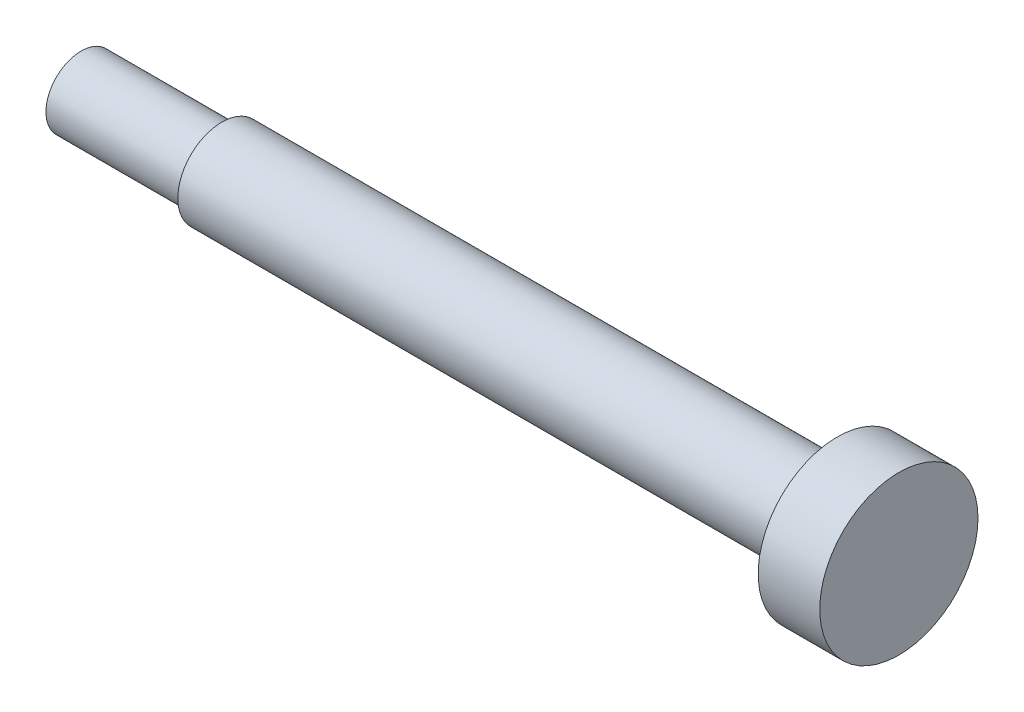
ISO-10303-21;
HEADER;
FILE_DESCRIPTION(('STEP AP214'),'2;1');
FILE_NAME('part.step','',(''),(''),'','','');
FILE_SCHEMA(('AUTOMOTIVE_DESIGN { 1 0 10303 214 1 1 1 1 }'));
ENDSEC;
DATA;
#1=APPLICATION_CONTEXT('core data for automotive mechanical design processes');
#2=APPLICATION_PROTOCOL_DEFINITION('international standard','automotive_design',2000,#1);
#3=PRODUCT_CONTEXT('',#1,'mechanical');
#4=PRODUCT('Part','Part','',(#3));
#5=PRODUCT_RELATED_PRODUCT_CATEGORY('part','',(#4));
#6=PRODUCT_DEFINITION_FORMATION('','',#4);
#7=PRODUCT_DEFINITION_CONTEXT('part definition',#1,'design');
#8=PRODUCT_DEFINITION('design','',#6,#7);
#9=PRODUCT_DEFINITION_SHAPE('','',#8);
#10=(LENGTH_UNIT() NAMED_UNIT(*) SI_UNIT(.MILLI.,.METRE.));
#11=(NAMED_UNIT(*) PLANE_ANGLE_UNIT() SI_UNIT($,.RADIAN.));
#12=(NAMED_UNIT(*) SI_UNIT($,.STERADIAN.) SOLID_ANGLE_UNIT());
#13=UNCERTAINTY_MEASURE_WITH_UNIT(LENGTH_MEASURE(1.E-05),#10,'distance_accuracy_value','');
#14=(GEOMETRIC_REPRESENTATION_CONTEXT(3) GLOBAL_UNCERTAINTY_ASSIGNED_CONTEXT((#13)) GLOBAL_UNIT_ASSIGNED_CONTEXT((#10,
#11,#12)) REPRESENTATION_CONTEXT('',''));
#15=CARTESIAN_POINT('',(0.,0.,0.));
#16=DIRECTION('',(0.,0.,1.));
#17=DIRECTION('',(1.,0.,0.));
#18=AXIS2_PLACEMENT_3D('',#15,#16,#17);
#19=CARTESIAN_POINT('',(3.5,0.,0.));
#20=DIRECTION('',(1.,0.,0.));
#21=DIRECTION('',(0.,0.,-1.));
#22=AXIS2_PLACEMENT_3D('',#19,#20,#21);
#23=PLANE('',#22);
#24=CARTESIAN_POINT('',(3.5,0.,0.));
#25=DIRECTION('',(1.,0.,0.));
#26=DIRECTION('',(0.,0.,-1.));
#27=AXIS2_PLACEMENT_3D('',#24,#25,#26);
#28=CIRCLE('',#27,4.49999999999999);
#29=CARTESIAN_POINT('',(3.5,0.,-4.49999999999999));
#30=VERTEX_POINT('',#29);
#31=EDGE_CURVE('E10',#30,#30,#28,.T.);
#32=ORIENTED_EDGE('',*,*,#31,.T.);
#33=EDGE_LOOP('',(#32));
#34=FACE_BOUND('',#33,.T.);
#35=ADVANCED_FACE('F35',(#34),#23,.T.);
#36=CARTESIAN_POINT('',(0.,0.,0.));
#37=DIRECTION('',(1.,0.,0.));
#38=DIRECTION('',(0.,0.,-1.));
#39=AXIS2_PLACEMENT_3D('',#36,#37,#38);
#40=CYLINDRICAL_SURFACE('',#39,4.49999999999999);
#41=CARTESIAN_POINT('',(0.,0.,0.));
#42=DIRECTION('',(1.,0.,0.));
#43=DIRECTION('',(0.,0.,-1.));
#44=AXIS2_PLACEMENT_3D('',#41,#42,#43);
#45=CIRCLE('',#44,4.49999999999999);
#46=CARTESIAN_POINT('',(0.,0.,-4.49999999999999));
#47=VERTEX_POINT('',#46);
#48=EDGE_CURVE('E41',#47,#47,#45,.T.);
#49=ORIENTED_EDGE('',*,*,#48,.T.);
#50=EDGE_LOOP('',(#49));
#51=FACE_BOUND('',#50,.T.);
#52=ORIENTED_EDGE('',*,*,#31,.F.);
#53=EDGE_LOOP('',(#52));
#54=FACE_BOUND('',#53,.T.);
#55=ADVANCED_FACE('F73',(#51,#54),#40,.T.);
#56=CARTESIAN_POINT('',(0.,4.49999999999999,0.));
#57=DIRECTION('',(-1.,0.,0.));
#58=DIRECTION('',(0.,0.,1.));
#59=AXIS2_PLACEMENT_3D('',#56,#57,#58);
#60=PLANE('',#59);
#61=CARTESIAN_POINT('',(0.,0.,0.));
#62=DIRECTION('',(1.,0.,0.));
#63=DIRECTION('',(0.,0.,-1.));
#64=AXIS2_PLACEMENT_3D('',#61,#62,#63);
#65=CIRCLE('',#64,2.49999999999999);
#66=CARTESIAN_POINT('',(0.,0.,-2.49999999999999));
#67=VERTEX_POINT('',#66);
#68=EDGE_CURVE('E45',#67,#67,#65,.T.);
#69=ORIENTED_EDGE('',*,*,#68,.T.);
#70=EDGE_LOOP('',(#69));
#71=FACE_BOUND('',#70,.T.);
#72=ORIENTED_EDGE('',*,*,#48,.F.);
#73=EDGE_LOOP('',(#72));
#74=FACE_BOUND('',#73,.T.);
#75=ADVANCED_FACE('F77',(#71,#74),#60,.T.);
#76=CARTESIAN_POINT('',(0.,0.,0.));
#77=DIRECTION('',(1.,0.,0.));
#78=DIRECTION('',(0.,0.,-1.));
#79=AXIS2_PLACEMENT_3D('',#76,#77,#78);
#80=CYLINDRICAL_SURFACE('',#79,2.49999999999999);
#81=CARTESIAN_POINT('',(-35.,0.,0.));
#82=DIRECTION('',(1.,0.,0.));
#83=DIRECTION('',(0.,0.,-1.));
#84=AXIS2_PLACEMENT_3D('',#81,#82,#83);
#85=CIRCLE('',#84,2.49999999999999);
#86=CARTESIAN_POINT('',(-35.,0.,-2.49999999999999));
#87=VERTEX_POINT('',#86);
#88=EDGE_CURVE('E49',#87,#87,#85,.T.);
#89=ORIENTED_EDGE('',*,*,#88,.T.);
#90=EDGE_LOOP('',(#89));
#91=FACE_BOUND('',#90,.T.);
#92=ORIENTED_EDGE('',*,*,#68,.F.);
#93=EDGE_LOOP('',(#92));
#94=FACE_BOUND('',#93,.T.);
#95=ADVANCED_FACE('F81',(#91,#94),#80,.T.);
#96=CARTESIAN_POINT('',(-35.,2.49999999999999,0.));
#97=DIRECTION('',(-1.,0.,0.));
#98=DIRECTION('',(0.,0.,1.));
#99=AXIS2_PLACEMENT_3D('',#96,#97,#98);
#100=PLANE('',#99);
#101=CARTESIAN_POINT('',(-35.,0.,0.));
#102=DIRECTION('',(1.,0.,0.));
#103=DIRECTION('',(0.,0.,-1.));
#104=AXIS2_PLACEMENT_3D('',#101,#102,#103);
#105=CIRCLE('',#104,1.99999999999999);
#106=CARTESIAN_POINT('',(-35.,0.,-1.99999999999999));
#107=VERTEX_POINT('',#106);
#108=EDGE_CURVE('E54',#107,#107,#105,.T.);
#109=ORIENTED_EDGE('',*,*,#108,.T.);
#110=EDGE_LOOP('',(#109));
#111=FACE_BOUND('',#110,.T.);
#112=ORIENTED_EDGE('',*,*,#88,.F.);
#113=EDGE_LOOP('',(#112));
#114=FACE_BOUND('',#113,.T.);
#115=ADVANCED_FACE('F70',(#111,#114),#100,.T.);
#116=CARTESIAN_POINT('',(0.,0.,0.));
#117=DIRECTION('',(1.,0.,0.));
#118=DIRECTION('',(0.,0.,-1.));
#119=AXIS2_PLACEMENT_3D('',#116,#117,#118);
#120=CYLINDRICAL_SURFACE('',#119,1.99999999999999);
#121=CARTESIAN_POINT('',(-43.,0.,0.));
#122=DIRECTION('',(1.,0.,0.));
#123=DIRECTION('',(0.,0.,-1.));
#124=AXIS2_PLACEMENT_3D('',#121,#122,#123);
#125=CIRCLE('',#124,1.99999999999999);
#126=CARTESIAN_POINT('',(-43.,0.,-1.99999999999999));
#127=VERTEX_POINT('',#126);
#128=EDGE_CURVE('E57',#127,#127,#125,.T.);
#129=ORIENTED_EDGE('',*,*,#128,.T.);
#130=EDGE_LOOP('',(#129));
#131=FACE_BOUND('',#130,.T.);
#132=ORIENTED_EDGE('',*,*,#108,.F.);
#133=EDGE_LOOP('',(#132));
#134=FACE_BOUND('',#133,.T.);
#135=ADVANCED_FACE('F61',(#131,#134),#120,.T.);
#136=CARTESIAN_POINT('',(-43.,1.99999999999999,0.));
#137=DIRECTION('',(-1.,0.,0.));
#138=DIRECTION('',(0.,0.,1.));
#139=AXIS2_PLACEMENT_3D('',#136,#137,#138);
#140=PLANE('',#139);
#141=ORIENTED_EDGE('',*,*,#128,.F.);
#142=EDGE_LOOP('',(#141));
#143=FACE_BOUND('',#142,.T.);
#144=ADVANCED_FACE('F64',(#143),#140,.T.);
#145=CLOSED_SHELL('',(#35,#55,#75,#95,#115,#135,#144));
#146=MANIFOLD_SOLID_BREP('B2',#145);
#147=ADVANCED_BREP_SHAPE_REPRESENTATION('',(#18,#146),#14);
#148=SHAPE_DEFINITION_REPRESENTATION(#9,#147);
ENDSEC;
END-ISO-10303-21;
